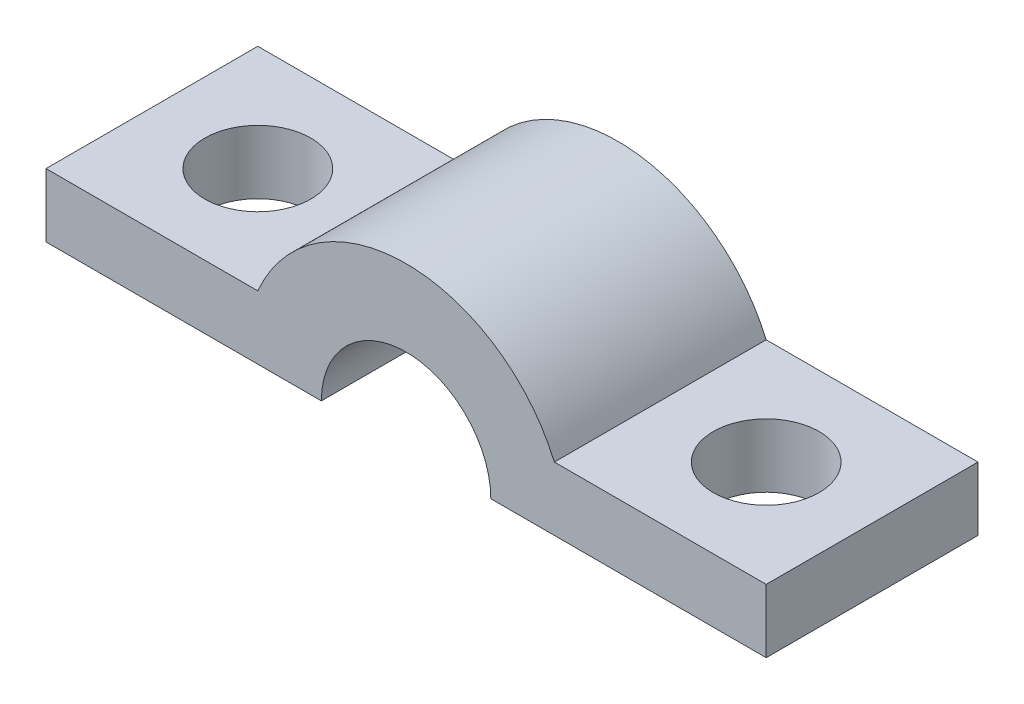
ISO-10303-21;
HEADER;
FILE_DESCRIPTION(('STEP AP214'),'2;1');
FILE_NAME('part.step','',(''),(''),'','','');
FILE_SCHEMA(('AUTOMOTIVE_DESIGN { 1 0 10303 214 1 1 1 1 }'));
ENDSEC;
DATA;
#1=APPLICATION_CONTEXT('core data for automotive mechanical design processes');
#2=APPLICATION_PROTOCOL_DEFINITION('international standard','automotive_design',2000,#1);
#3=PRODUCT_CONTEXT('',#1,'mechanical');
#4=PRODUCT('Part','Part','',(#3));
#5=PRODUCT_RELATED_PRODUCT_CATEGORY('part','',(#4));
#6=PRODUCT_DEFINITION_FORMATION('','',#4);
#7=PRODUCT_DEFINITION_CONTEXT('part definition',#1,'design');
#8=PRODUCT_DEFINITION('design','',#6,#7);
#9=PRODUCT_DEFINITION_SHAPE('','',#8);
#10=(LENGTH_UNIT() NAMED_UNIT(*) SI_UNIT(.MILLI.,.METRE.));
#11=(NAMED_UNIT(*) PLANE_ANGLE_UNIT() SI_UNIT($,.RADIAN.));
#12=(NAMED_UNIT(*) SI_UNIT($,.STERADIAN.) SOLID_ANGLE_UNIT());
#13=UNCERTAINTY_MEASURE_WITH_UNIT(LENGTH_MEASURE(1.E-05),#10,'distance_accuracy_value','');
#14=(GEOMETRIC_REPRESENTATION_CONTEXT(3) GLOBAL_UNCERTAINTY_ASSIGNED_CONTEXT((#13)) GLOBAL_UNIT_ASSIGNED_CONTEXT((#10,
#11,#12)) REPRESENTATION_CONTEXT('',''));
#15=CARTESIAN_POINT('',(0.,0.,0.));
#16=DIRECTION('',(0.,0.,1.));
#17=DIRECTION('',(1.,0.,0.));
#18=AXIS2_PLACEMENT_3D('',#15,#16,#17);
#19=CARTESIAN_POINT('',(5.08,0.,12.7));
#20=DIRECTION('',(0.,0.,-1.));
#21=DIRECTION('',(-1.,0.,0.));
#22=AXIS2_PLACEMENT_3D('',#19,#20,#21);
#23=CYLINDRICAL_SURFACE('',#22,5.08);
#24=CARTESIAN_POINT('',(5.08,0.,0.));
#25=DIRECTION('',(0.,0.,-1.));
#26=DIRECTION('',(-1.,0.,0.));
#27=AXIS2_PLACEMENT_3D('',#24,#25,#26);
#28=CIRCLE('',#27,5.08);
#29=CARTESIAN_POINT('',(0.,0.,0.));
#30=VERTEX_POINT('',#29);
#31=CARTESIAN_POINT('',(10.16,0.,0.));
#32=VERTEX_POINT('',#31);
#33=EDGE_CURVE('E135',#30,#32,#28,.T.);
#34=ORIENTED_EDGE('',*,*,#33,.T.);
#35=DIRECTION('',(0.,0.,-1.));
#36=VECTOR('',#35,1.);
#37=CARTESIAN_POINT('',(10.16,0.,12.7));
#38=LINE('',#37,#36);
#39=CARTESIAN_POINT('',(10.16,0.,12.7));
#40=VERTEX_POINT('',#39);
#41=EDGE_CURVE('E11',#40,#32,#38,.T.);
#42=ORIENTED_EDGE('',*,*,#41,.F.);
#43=CARTESIAN_POINT('',(5.08,0.,12.7));
#44=DIRECTION('',(0.,0.,-1.));
#45=DIRECTION('',(-1.,0.,0.));
#46=AXIS2_PLACEMENT_3D('',#43,#44,#45);
#47=CIRCLE('',#46,5.08);
#48=CARTESIAN_POINT('',(0.,0.,12.7));
#49=VERTEX_POINT('',#48);
#50=EDGE_CURVE('E150',#49,#40,#47,.T.);
#51=ORIENTED_EDGE('',*,*,#50,.F.);
#52=DIRECTION('',(0.,0.,-1.));
#53=VECTOR('',#52,1.);
#54=CARTESIAN_POINT('',(0.,0.,12.7));
#55=LINE('',#54,#53);
#56=EDGE_CURVE('E131',#49,#30,#55,.T.);
#57=ORIENTED_EDGE('',*,*,#56,.T.);
#58=EDGE_LOOP('',(#34,#42,#51,#57));
#59=FACE_BOUND('',#58,.T.);
#60=ADVANCED_FACE('F39',(#59),#23,.F.);
#61=CARTESIAN_POINT('',(26.67,0.,12.7));
#62=DIRECTION('',(0.,1.,0.));
#63=DIRECTION('',(0.,0.,1.));
#64=AXIS2_PLACEMENT_3D('',#61,#62,#63);
#65=PLANE('',#64);
#66=CARTESIAN_POINT('',(20.32,0.,6.35));
#67=DIRECTION('',(0.,1.,0.));
#68=DIRECTION('',(1.,0.,0.));
#69=AXIS2_PLACEMENT_3D('',#66,#67,#68);
#70=CIRCLE('',#69,3.17499999999999);
#71=CARTESIAN_POINT('',(23.495,0.,6.35));
#72=VERTEX_POINT('',#71);
#73=EDGE_CURVE('E183',#72,#72,#70,.T.);
#74=ORIENTED_EDGE('',*,*,#73,.T.);
#75=EDGE_LOOP('',(#74));
#76=FACE_BOUND('',#75,.T.);
#77=DIRECTION('',(1.,0.,0.));
#78=VECTOR('',#77,1.);
#79=CARTESIAN_POINT('',(26.67,0.,0.));
#80=LINE('',#79,#78);
#81=CARTESIAN_POINT('',(26.67,0.,0.));
#82=VERTEX_POINT('',#81);
#83=EDGE_CURVE('E138',#32,#82,#80,.T.);
#84=ORIENTED_EDGE('',*,*,#83,.T.);
#85=DIRECTION('',(0.,0.,-1.));
#86=VECTOR('',#85,1.);
#87=CARTESIAN_POINT('',(26.67,0.,12.7));
#88=LINE('',#87,#86);
#89=CARTESIAN_POINT('',(26.67,0.,12.7));
#90=VERTEX_POINT('',#89);
#91=EDGE_CURVE('E47',#90,#82,#88,.T.);
#92=ORIENTED_EDGE('',*,*,#91,.F.);
#93=DIRECTION('',(1.,0.,0.));
#94=VECTOR('',#93,1.);
#95=CARTESIAN_POINT('',(26.67,0.,12.7));
#96=LINE('',#95,#94);
#97=EDGE_CURVE('E98',#40,#90,#96,.T.);
#98=ORIENTED_EDGE('',*,*,#97,.F.);
#99=ORIENTED_EDGE('',*,*,#41,.T.);
#100=EDGE_LOOP('',(#84,#92,#98,#99));
#101=FACE_BOUND('',#100,.T.);
#102=ADVANCED_FACE('F215',(#76,#101),#65,.F.);
#103=CARTESIAN_POINT('',(26.67,3.81,12.7));
#104=DIRECTION('',(-1.,0.,0.));
#105=DIRECTION('',(0.,0.,1.));
#106=AXIS2_PLACEMENT_3D('',#103,#104,#105);
#107=PLANE('',#106);
#108=DIRECTION('',(0.,1.,0.));
#109=VECTOR('',#108,1.);
#110=CARTESIAN_POINT('',(26.67,3.81,0.));
#111=LINE('',#110,#109);
#112=CARTESIAN_POINT('',(26.67,3.81,0.));
#113=VERTEX_POINT('',#112);
#114=EDGE_CURVE('E141',#82,#113,#111,.T.);
#115=ORIENTED_EDGE('',*,*,#114,.T.);
#116=DIRECTION('',(0.,0.,-1.));
#117=VECTOR('',#116,1.);
#118=CARTESIAN_POINT('',(26.67,3.81,12.7));
#119=LINE('',#118,#117);
#120=CARTESIAN_POINT('',(26.67,3.81,12.7));
#121=VERTEX_POINT('',#120);
#122=EDGE_CURVE('E157',#121,#113,#119,.T.);
#123=ORIENTED_EDGE('',*,*,#122,.F.);
#124=DIRECTION('',(0.,1.,0.));
#125=VECTOR('',#124,1.);
#126=CARTESIAN_POINT('',(26.67,3.81,12.7));
#127=LINE('',#126,#125);
#128=EDGE_CURVE('E165',#90,#121,#127,.T.);
#129=ORIENTED_EDGE('',*,*,#128,.F.);
#130=ORIENTED_EDGE('',*,*,#91,.T.);
#131=EDGE_LOOP('',(#115,#123,#129,#130));
#132=FACE_BOUND('',#131,.T.);
#133=ADVANCED_FACE('F163',(#132),#107,.F.);
#134=CARTESIAN_POINT('',(13.97,3.81,12.7));
#135=DIRECTION('',(0.,-1.,0.));
#136=DIRECTION('',(1.,0.,0.));
#137=AXIS2_PLACEMENT_3D('',#134,#135,#136);
#138=PLANE('',#137);
#139=CARTESIAN_POINT('',(20.32,3.81,6.35));
#140=DIRECTION('',(0.,1.,0.));
#141=DIRECTION('',(1.,0.,0.));
#142=AXIS2_PLACEMENT_3D('',#139,#140,#141);
#143=CIRCLE('',#142,3.17499999999999);
#144=CARTESIAN_POINT('',(23.495,3.81,6.35));
#145=VERTEX_POINT('',#144);
#146=EDGE_CURVE('E186',#145,#145,#143,.T.);
#147=ORIENTED_EDGE('',*,*,#146,.F.);
#148=EDGE_LOOP('',(#147));
#149=FACE_BOUND('',#148,.T.);
#150=DIRECTION('',(-1.,0.,0.));
#151=VECTOR('',#150,1.);
#152=CARTESIAN_POINT('',(13.97,3.81,0.));
#153=LINE('',#152,#151);
#154=CARTESIAN_POINT('',(13.97,3.81,0.));
#155=VERTEX_POINT('',#154);
#156=EDGE_CURVE('E143',#113,#155,#153,.T.);
#157=ORIENTED_EDGE('',*,*,#156,.T.);
#158=DIRECTION('',(0.,0.,-1.));
#159=VECTOR('',#158,1.);
#160=CARTESIAN_POINT('',(13.97,3.81,12.7));
#161=LINE('',#160,#159);
#162=CARTESIAN_POINT('',(13.97,3.81,12.7));
#163=VERTEX_POINT('',#162);
#164=EDGE_CURVE('E154',#163,#155,#161,.T.);
#165=ORIENTED_EDGE('',*,*,#164,.F.);
#166=DIRECTION('',(-1.,0.,0.));
#167=VECTOR('',#166,1.);
#168=CARTESIAN_POINT('',(13.97,3.81,12.7));
#169=LINE('',#168,#167);
#170=EDGE_CURVE('E177',#121,#163,#169,.T.);
#171=ORIENTED_EDGE('',*,*,#170,.F.);
#172=ORIENTED_EDGE('',*,*,#122,.T.);
#173=EDGE_LOOP('',(#157,#165,#171,#172));
#174=FACE_BOUND('',#173,.T.);
#175=ADVANCED_FACE('F173',(#149,#174),#138,.F.);
#176=CARTESIAN_POINT('',(5.08,0.,12.7));
#177=DIRECTION('',(0.,0.,-1.));
#178=DIRECTION('',(-1.,0.,0.));
#179=AXIS2_PLACEMENT_3D('',#176,#177,#178);
#180=CYLINDRICAL_SURFACE('',#179,9.67203184444716);
#181=CARTESIAN_POINT('',(5.08,0.,0.));
#182=DIRECTION('',(0.,0.,1.));
#183=DIRECTION('',(-1.,0.,0.));
#184=AXIS2_PLACEMENT_3D('',#181,#182,#183);
#185=CIRCLE('',#184,9.67203184444716);
#186=CARTESIAN_POINT('',(-3.81,3.81,0.));
#187=VERTEX_POINT('',#186);
#188=EDGE_CURVE('E145',#155,#187,#185,.T.);
#189=ORIENTED_EDGE('',*,*,#188,.T.);
#190=DIRECTION('',(0.,0.,-1.));
#191=VECTOR('',#190,1.);
#192=CARTESIAN_POINT('',(-3.81,3.81,12.7));
#193=LINE('',#192,#191);
#194=CARTESIAN_POINT('',(-3.81,3.81,12.7));
#195=VERTEX_POINT('',#194);
#196=EDGE_CURVE('E126',#195,#187,#193,.T.);
#197=ORIENTED_EDGE('',*,*,#196,.F.);
#198=CARTESIAN_POINT('',(5.08,0.,12.7));
#199=DIRECTION('',(0.,0.,1.));
#200=DIRECTION('',(-1.,0.,0.));
#201=AXIS2_PLACEMENT_3D('',#198,#199,#200);
#202=CIRCLE('',#201,9.67203184444716);
#203=EDGE_CURVE('E117',#163,#195,#202,.T.);
#204=ORIENTED_EDGE('',*,*,#203,.F.);
#205=ORIENTED_EDGE('',*,*,#164,.T.);
#206=EDGE_LOOP('',(#189,#197,#204,#205));
#207=FACE_BOUND('',#206,.T.);
#208=ADVANCED_FACE('F176',(#207),#180,.T.);
#209=CARTESIAN_POINT('',(-3.81,3.81,12.7));
#210=DIRECTION('',(0.,-1.,0.));
#211=DIRECTION('',(1.,0.,0.));
#212=AXIS2_PLACEMENT_3D('',#209,#210,#211);
#213=PLANE('',#212);
#214=CARTESIAN_POINT('',(-10.16,3.81,6.35));
#215=DIRECTION('',(0.,1.,0.));
#216=DIRECTION('',(-1.,0.,0.));
#217=AXIS2_PLACEMENT_3D('',#214,#215,#216);
#218=CIRCLE('',#217,3.175);
#219=CARTESIAN_POINT('',(-13.335,3.81,6.35));
#220=VERTEX_POINT('',#219);
#221=EDGE_CURVE('E189',#220,#220,#218,.T.);
#222=ORIENTED_EDGE('',*,*,#221,.F.);
#223=EDGE_LOOP('',(#222));
#224=FACE_BOUND('',#223,.T.);
#225=DIRECTION('',(-1.,0.,0.));
#226=VECTOR('',#225,1.);
#227=CARTESIAN_POINT('',(-3.81,3.81,0.));
#228=LINE('',#227,#226);
#229=CARTESIAN_POINT('',(-16.51,3.81,0.));
#230=VERTEX_POINT('',#229);
#231=EDGE_CURVE('E125',#187,#230,#228,.T.);
#232=ORIENTED_EDGE('',*,*,#231,.T.);
#233=DIRECTION('',(0.,0.,-1.));
#234=VECTOR('',#233,1.);
#235=CARTESIAN_POINT('',(-16.51,3.81,12.7));
#236=LINE('',#235,#234);
#237=CARTESIAN_POINT('',(-16.51,3.81,12.7));
#238=VERTEX_POINT('',#237);
#239=EDGE_CURVE('E122',#238,#230,#236,.T.);
#240=ORIENTED_EDGE('',*,*,#239,.F.);
#241=DIRECTION('',(-1.,0.,0.));
#242=VECTOR('',#241,1.);
#243=CARTESIAN_POINT('',(-3.81,3.81,12.7));
#244=LINE('',#243,#242);
#245=EDGE_CURVE('E111',#195,#238,#244,.T.);
#246=ORIENTED_EDGE('',*,*,#245,.F.);
#247=ORIENTED_EDGE('',*,*,#196,.T.);
#248=EDGE_LOOP('',(#232,#240,#246,#247));
#249=FACE_BOUND('',#248,.T.);
#250=ADVANCED_FACE('F123',(#224,#249),#213,.F.);
#251=CARTESIAN_POINT('',(-16.51,3.81,12.7));
#252=DIRECTION('',(1.,0.,0.));
#253=DIRECTION('',(0.,0.,-1.));
#254=AXIS2_PLACEMENT_3D('',#251,#252,#253);
#255=PLANE('',#254);
#256=DIRECTION('',(0.,-1.,0.));
#257=VECTOR('',#256,1.);
#258=CARTESIAN_POINT('',(-16.51,3.81,0.));
#259=LINE('',#258,#257);
#260=CARTESIAN_POINT('',(-16.51,0.,0.));
#261=VERTEX_POINT('',#260);
#262=EDGE_CURVE('E84',#230,#261,#259,.T.);
#263=ORIENTED_EDGE('',*,*,#262,.T.);
#264=DIRECTION('',(0.,0.,-1.));
#265=VECTOR('',#264,1.);
#266=CARTESIAN_POINT('',(-16.51,0.,12.7));
#267=LINE('',#266,#265);
#268=CARTESIAN_POINT('',(-16.51,0.,12.7));
#269=VERTEX_POINT('',#268);
#270=EDGE_CURVE('E127',#269,#261,#267,.T.);
#271=ORIENTED_EDGE('',*,*,#270,.F.);
#272=DIRECTION('',(0.,-1.,0.));
#273=VECTOR('',#272,1.);
#274=CARTESIAN_POINT('',(-16.51,3.81,12.7));
#275=LINE('',#274,#273);
#276=EDGE_CURVE('E115',#238,#269,#275,.T.);
#277=ORIENTED_EDGE('',*,*,#276,.F.);
#278=ORIENTED_EDGE('',*,*,#239,.T.);
#279=EDGE_LOOP('',(#263,#271,#277,#278));
#280=FACE_BOUND('',#279,.T.);
#281=ADVANCED_FACE('F129',(#280),#255,.F.);
#282=CARTESIAN_POINT('',(-16.51,0.,12.7));
#283=DIRECTION('',(0.,1.,0.));
#284=DIRECTION('',(0.,0.,1.));
#285=AXIS2_PLACEMENT_3D('',#282,#283,#284);
#286=PLANE('',#285);
#287=CARTESIAN_POINT('',(-10.16,0.,6.35));
#288=DIRECTION('',(0.,1.,0.));
#289=DIRECTION('',(-1.,0.,0.));
#290=AXIS2_PLACEMENT_3D('',#287,#288,#289);
#291=CIRCLE('',#290,3.175);
#292=CARTESIAN_POINT('',(-13.335,0.,6.35));
#293=VERTEX_POINT('',#292);
#294=EDGE_CURVE('E139',#293,#293,#291,.T.);
#295=ORIENTED_EDGE('',*,*,#294,.T.);
#296=EDGE_LOOP('',(#295));
#297=FACE_BOUND('',#296,.T.);
#298=DIRECTION('',(1.,0.,0.));
#299=VECTOR('',#298,1.);
#300=CARTESIAN_POINT('',(-16.51,0.,0.));
#301=LINE('',#300,#299);
#302=EDGE_CURVE('E90',#261,#30,#301,.T.);
#303=ORIENTED_EDGE('',*,*,#302,.T.);
#304=ORIENTED_EDGE('',*,*,#56,.F.);
#305=DIRECTION('',(1.,0.,0.));
#306=VECTOR('',#305,1.);
#307=CARTESIAN_POINT('',(-16.51,0.,12.7));
#308=LINE('',#307,#306);
#309=EDGE_CURVE('E55',#269,#49,#308,.T.);
#310=ORIENTED_EDGE('',*,*,#309,.F.);
#311=ORIENTED_EDGE('',*,*,#270,.T.);
#312=EDGE_LOOP('',(#303,#304,#310,#311));
#313=FACE_BOUND('',#312,.T.);
#314=ADVANCED_FACE('F195',(#297,#313),#286,.F.);
#315=CARTESIAN_POINT('',(5.08,0.,12.7));
#316=DIRECTION('',(0.,0.,-1.));
#317=DIRECTION('',(-1.,0.,0.));
#318=AXIS2_PLACEMENT_3D('',#315,#316,#317);
#319=PLANE('',#318);
#320=ORIENTED_EDGE('',*,*,#50,.T.);
#321=ORIENTED_EDGE('',*,*,#97,.T.);
#322=ORIENTED_EDGE('',*,*,#128,.T.);
#323=ORIENTED_EDGE('',*,*,#170,.T.);
#324=ORIENTED_EDGE('',*,*,#203,.T.);
#325=ORIENTED_EDGE('',*,*,#245,.T.);
#326=ORIENTED_EDGE('',*,*,#276,.T.);
#327=ORIENTED_EDGE('',*,*,#309,.T.);
#328=EDGE_LOOP('',(#320,#321,#322,#323,#324,#325,#326,#327));
#329=FACE_BOUND('',#328,.T.);
#330=ADVANCED_FACE('F113',(#329),#319,.F.);
#331=CARTESIAN_POINT('',(5.08,0.,0.));
#332=DIRECTION('',(0.,0.,-1.));
#333=DIRECTION('',(-1.,0.,0.));
#334=AXIS2_PLACEMENT_3D('',#331,#332,#333);
#335=PLANE('',#334);
#336=ORIENTED_EDGE('',*,*,#33,.F.);
#337=ORIENTED_EDGE('',*,*,#302,.F.);
#338=ORIENTED_EDGE('',*,*,#262,.F.);
#339=ORIENTED_EDGE('',*,*,#231,.F.);
#340=ORIENTED_EDGE('',*,*,#188,.F.);
#341=ORIENTED_EDGE('',*,*,#156,.F.);
#342=ORIENTED_EDGE('',*,*,#114,.F.);
#343=ORIENTED_EDGE('',*,*,#83,.F.);
#344=EDGE_LOOP('',(#336,#337,#338,#339,#340,#341,#342,#343));
#345=FACE_BOUND('',#344,.T.);
#346=ADVANCED_FACE('F169',(#345),#335,.T.);
#347=CARTESIAN_POINT('',(-10.16,0.,6.35));
#348=DIRECTION('',(0.,1.,0.));
#349=DIRECTION('',(-1.,0.,0.));
#350=AXIS2_PLACEMENT_3D('',#347,#348,#349);
#351=CYLINDRICAL_SURFACE('',#350,3.175);
#352=ORIENTED_EDGE('',*,*,#294,.F.);
#353=EDGE_LOOP('',(#352));
#354=FACE_BOUND('',#353,.T.);
#355=ORIENTED_EDGE('',*,*,#221,.T.);
#356=EDGE_LOOP('',(#355));
#357=FACE_BOUND('',#356,.T.);
#358=ADVANCED_FACE('F197',(#354,#357),#351,.F.);
#359=CARTESIAN_POINT('',(20.32,0.,6.35));
#360=DIRECTION('',(0.,1.,0.));
#361=DIRECTION('',(-1.,0.,0.));
#362=AXIS2_PLACEMENT_3D('',#359,#360,#361);
#363=CYLINDRICAL_SURFACE('',#362,3.17499999999999);
#364=ORIENTED_EDGE('',*,*,#73,.F.);
#365=EDGE_LOOP('',(#364));
#366=FACE_BOUND('',#365,.T.);
#367=ORIENTED_EDGE('',*,*,#146,.T.);
#368=EDGE_LOOP('',(#367));
#369=FACE_BOUND('',#368,.T.);
#370=ADVANCED_FACE('F200',(#366,#369),#363,.F.);
#371=CLOSED_SHELL('',(#60,#102,#133,#175,#208,#250,#281,#314,#330,#346,#358,#370));
#372=MANIFOLD_SOLID_BREP('B2',#371);
#373=ADVANCED_BREP_SHAPE_REPRESENTATION('',(#18,#372),#14);
#374=SHAPE_DEFINITION_REPRESENTATION(#9,#373);
ENDSEC;
END-ISO-10303-21;
